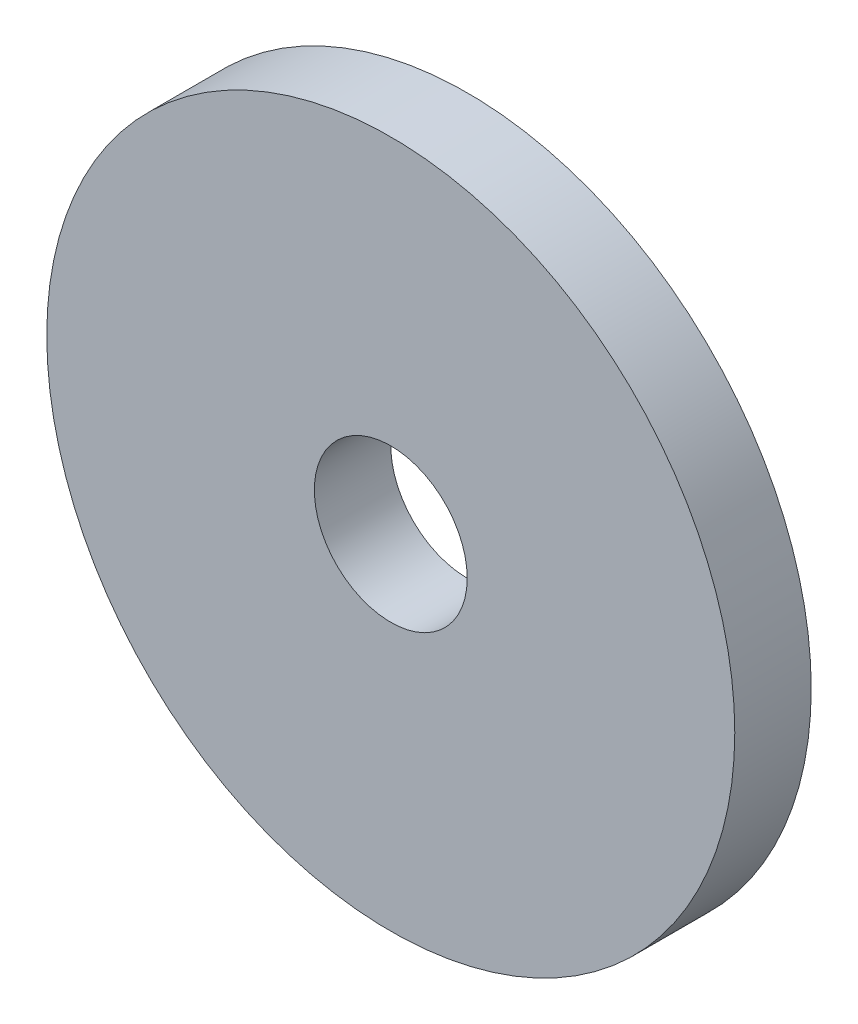
ISO-10303-21;
HEADER;
FILE_DESCRIPTION(('STEP AP214'),'2;1');
FILE_NAME('part.step','',(''),(''),'','','');
FILE_SCHEMA(('AUTOMOTIVE_DESIGN { 1 0 10303 214 1 1 1 1 }'));
ENDSEC;
DATA;
#1=APPLICATION_CONTEXT('core data for automotive mechanical design processes');
#2=APPLICATION_PROTOCOL_DEFINITION('international standard','automotive_design',2000,#1);
#3=PRODUCT_CONTEXT('',#1,'mechanical');
#4=PRODUCT('Part','Part','',(#3));
#5=PRODUCT_RELATED_PRODUCT_CATEGORY('part','',(#4));
#6=PRODUCT_DEFINITION_FORMATION('','',#4);
#7=PRODUCT_DEFINITION_CONTEXT('part definition',#1,'design');
#8=PRODUCT_DEFINITION('design','',#6,#7);
#9=PRODUCT_DEFINITION_SHAPE('','',#8);
#10=(LENGTH_UNIT() NAMED_UNIT(*) SI_UNIT(.MILLI.,.METRE.));
#11=(NAMED_UNIT(*) PLANE_ANGLE_UNIT() SI_UNIT($,.RADIAN.));
#12=(NAMED_UNIT(*) SI_UNIT($,.STERADIAN.) SOLID_ANGLE_UNIT());
#13=UNCERTAINTY_MEASURE_WITH_UNIT(LENGTH_MEASURE(1.E-05),#10,'distance_accuracy_value','');
#14=(GEOMETRIC_REPRESENTATION_CONTEXT(3) GLOBAL_UNCERTAINTY_ASSIGNED_CONTEXT((#13)) GLOBAL_UNIT_ASSIGNED_CONTEXT((#10,
#11,#12)) REPRESENTATION_CONTEXT('',''));
#15=CARTESIAN_POINT('',(0.,0.,0.));
#16=DIRECTION('',(0.,0.,1.));
#17=DIRECTION('',(1.,0.,0.));
#18=AXIS2_PLACEMENT_3D('',#15,#16,#17);
#19=CARTESIAN_POINT('',(0.,0.,4.));
#20=DIRECTION('',(0.,0.,1.));
#21=DIRECTION('',(1.,0.,0.));
#22=AXIS2_PLACEMENT_3D('',#19,#20,#21);
#23=PLANE('',#22);
#24=CARTESIAN_POINT('',(0.,0.,4.));
#25=DIRECTION('',(0.,0.,1.));
#26=DIRECTION('',(1.,0.,0.));
#27=AXIS2_PLACEMENT_3D('',#24,#25,#26);
#28=CIRCLE('',#27,18.);
#29=CARTESIAN_POINT('',(18.,0.,4.));
#30=VERTEX_POINT('',#29);
#31=EDGE_CURVE('E10',#30,#30,#28,.T.);
#32=ORIENTED_EDGE('',*,*,#31,.T.);
#33=EDGE_LOOP('',(#32));
#34=FACE_BOUND('',#33,.T.);
#35=CARTESIAN_POINT('',(0.,0.,4.));
#36=DIRECTION('',(0.,0.,1.));
#37=DIRECTION('',(1.,0.,0.));
#38=AXIS2_PLACEMENT_3D('',#35,#36,#37);
#39=CIRCLE('',#38,4.);
#40=CARTESIAN_POINT('',(4.,0.,4.));
#41=VERTEX_POINT('',#40);
#42=EDGE_CURVE('E39',#41,#41,#39,.T.);
#43=ORIENTED_EDGE('',*,*,#42,.F.);
#44=EDGE_LOOP('',(#43));
#45=FACE_BOUND('',#44,.T.);
#46=ADVANCED_FACE('F28',(#34,#45),#23,.T.);
#47=CARTESIAN_POINT('',(0.,0.,0.));
#48=DIRECTION('',(0.,0.,1.));
#49=DIRECTION('',(1.,0.,0.));
#50=AXIS2_PLACEMENT_3D('',#47,#48,#49);
#51=PLANE('',#50);
#52=CARTESIAN_POINT('',(0.,0.,0.));
#53=DIRECTION('',(0.,0.,1.));
#54=DIRECTION('',(1.,0.,0.));
#55=AXIS2_PLACEMENT_3D('',#52,#53,#54);
#56=CIRCLE('',#55,18.);
#57=CARTESIAN_POINT('',(18.,0.,0.));
#58=VERTEX_POINT('',#57);
#59=EDGE_CURVE('E35',#58,#58,#56,.T.);
#60=ORIENTED_EDGE('',*,*,#59,.F.);
#61=EDGE_LOOP('',(#60));
#62=FACE_BOUND('',#61,.T.);
#63=CARTESIAN_POINT('',(0.,0.,0.));
#64=DIRECTION('',(0.,0.,1.));
#65=DIRECTION('',(1.,0.,0.));
#66=AXIS2_PLACEMENT_3D('',#63,#64,#65);
#67=CIRCLE('',#66,4.);
#68=CARTESIAN_POINT('',(4.,0.,0.));
#69=VERTEX_POINT('',#68);
#70=EDGE_CURVE('E43',#69,#69,#67,.T.);
#71=ORIENTED_EDGE('',*,*,#70,.T.);
#72=EDGE_LOOP('',(#71));
#73=FACE_BOUND('',#72,.T.);
#74=ADVANCED_FACE('F49',(#62,#73),#51,.F.);
#75=CARTESIAN_POINT('',(0.,0.,4.));
#76=DIRECTION('',(0.,0.,-1.));
#77=DIRECTION('',(-1.,0.,0.));
#78=AXIS2_PLACEMENT_3D('',#75,#76,#77);
#79=CYLINDRICAL_SURFACE('',#78,18.);
#80=ORIENTED_EDGE('',*,*,#31,.F.);
#81=EDGE_LOOP('',(#80));
#82=FACE_BOUND('',#81,.T.);
#83=ORIENTED_EDGE('',*,*,#59,.T.);
#84=EDGE_LOOP('',(#83));
#85=FACE_BOUND('',#84,.T.);
#86=ADVANCED_FACE('F30',(#82,#85),#79,.T.);
#87=CARTESIAN_POINT('',(0.,0.,4.));
#88=DIRECTION('',(0.,0.,-1.));
#89=DIRECTION('',(-1.,0.,0.));
#90=AXIS2_PLACEMENT_3D('',#87,#88,#89);
#91=CYLINDRICAL_SURFACE('',#90,4.);
#92=ORIENTED_EDGE('',*,*,#42,.T.);
#93=EDGE_LOOP('',(#92));
#94=FACE_BOUND('',#93,.T.);
#95=ORIENTED_EDGE('',*,*,#70,.F.);
#96=EDGE_LOOP('',(#95));
#97=FACE_BOUND('',#96,.T.);
#98=ADVANCED_FACE('F51',(#94,#97),#91,.F.);
#99=CLOSED_SHELL('',(#46,#74,#86,#98));
#100=MANIFOLD_SOLID_BREP('B2',#99);
#101=ADVANCED_BREP_SHAPE_REPRESENTATION('',(#18,#100),#14);
#102=SHAPE_DEFINITION_REPRESENTATION(#9,#101);
ENDSEC;
END-ISO-10303-21;
